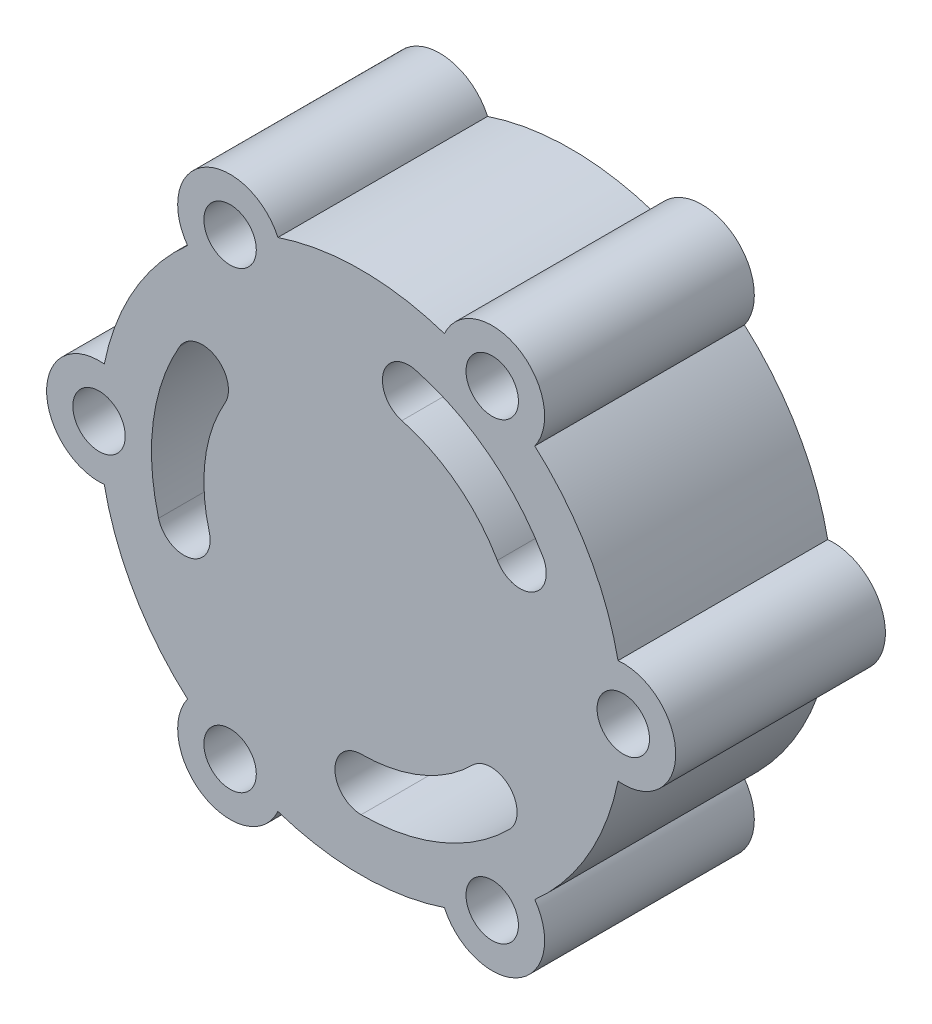
ISO-10303-21;
HEADER;
FILE_DESCRIPTION(('STEP AP214'),'2;1');
FILE_NAME('part.step','',(''),(''),'','','');
FILE_SCHEMA(('AUTOMOTIVE_DESIGN { 1 0 10303 214 1 1 1 1 }'));
ENDSEC;
DATA;
#1=APPLICATION_CONTEXT('core data for automotive mechanical design processes');
#2=APPLICATION_PROTOCOL_DEFINITION('international standard','automotive_design',2000,#1);
#3=PRODUCT_CONTEXT('',#1,'mechanical');
#4=PRODUCT('Part','Part','',(#3));
#5=PRODUCT_RELATED_PRODUCT_CATEGORY('part','',(#4));
#6=PRODUCT_DEFINITION_FORMATION('','',#4);
#7=PRODUCT_DEFINITION_CONTEXT('part definition',#1,'design');
#8=PRODUCT_DEFINITION('design','',#6,#7);
#9=PRODUCT_DEFINITION_SHAPE('','',#8);
#10=(LENGTH_UNIT() NAMED_UNIT(*) SI_UNIT(.MILLI.,.METRE.));
#11=(NAMED_UNIT(*) PLANE_ANGLE_UNIT() SI_UNIT($,.RADIAN.));
#12=(NAMED_UNIT(*) SI_UNIT($,.STERADIAN.) SOLID_ANGLE_UNIT());
#13=UNCERTAINTY_MEASURE_WITH_UNIT(LENGTH_MEASURE(1.E-05),#10,'distance_accuracy_value','');
#14=(GEOMETRIC_REPRESENTATION_CONTEXT(3) GLOBAL_UNCERTAINTY_ASSIGNED_CONTEXT((#13)) GLOBAL_UNIT_ASSIGNED_CONTEXT((#10,
#11,#12)) REPRESENTATION_CONTEXT('',''));
#15=CARTESIAN_POINT('',(0.,0.,0.));
#16=DIRECTION('',(0.,0.,1.));
#17=DIRECTION('',(1.,0.,0.));
#18=AXIS2_PLACEMENT_3D('',#15,#16,#17);
#19=CARTESIAN_POINT('',(57.5,91.650635094611,40.));
#20=DIRECTION('',(0.,0.,1.));
#21=DIRECTION('',(1.,0.,0.));
#22=AXIS2_PLACEMENT_3D('',#19,#20,#21);
#23=PLANE('',#22);
#24=CARTESIAN_POINT('',(45.,113.301270189222,40.));
#25=DIRECTION('',(0.,0.,1.));
#26=DIRECTION('',(1.,0.,0.));
#27=AXIS2_PLACEMENT_3D('',#24,#25,#26);
#28=CIRCLE('',#27,5.00000000000002);
#29=CARTESIAN_POINT('',(50.,113.301270189222,40.));
#30=VERTEX_POINT('',#29);
#31=EDGE_CURVE('E893',#30,#30,#28,.T.);
#32=ORIENTED_EDGE('',*,*,#31,.F.);
#33=EDGE_LOOP('',(#32));
#34=FACE_BOUND('',#33,.T.);
#35=CARTESIAN_POINT('',(45.,26.6987298107781,40.));
#36=DIRECTION('',(0.,0.,1.));
#37=DIRECTION('',(1.,0.,0.));
#38=AXIS2_PLACEMENT_3D('',#35,#36,#37);
#39=CIRCLE('',#38,5.);
#40=CARTESIAN_POINT('',(50.,26.6987298107781,40.));
#41=VERTEX_POINT('',#40);
#42=EDGE_CURVE('E909',#41,#41,#39,.T.);
#43=ORIENTED_EDGE('',*,*,#42,.F.);
#44=EDGE_LOOP('',(#43));
#45=FACE_BOUND('',#44,.T.);
#46=CARTESIAN_POINT('',(70.,70.,40.));
#47=DIRECTION('',(0.,0.,1.));
#48=DIRECTION('',(1.,0.,0.));
#49=AXIS2_PLACEMENT_3D('',#46,#47,#48);
#50=CIRCLE('',#49,39.9999999999999);
#51=CARTESIAN_POINT('',(35.3589838486223,89.9999999999996,40.));
#52=VERTEX_POINT('',#51);
#53=CARTESIAN_POINT('',(31.3629669484375,59.6472381958987,40.));
#54=VERTEX_POINT('',#53);
#55=EDGE_CURVE('E214',#52,#54,#50,.T.);
#56=ORIENTED_EDGE('',*,*,#55,.F.);
#57=CARTESIAN_POINT('',(39.6891108675447,87.4999999999995,40.));
#58=DIRECTION('',(0.,0.,1.));
#59=DIRECTION('',(1.,0.,0.));
#60=AXIS2_PLACEMENT_3D('',#57,#58,#59);
#61=CIRCLE('',#60,5.);
#62=CARTESIAN_POINT('',(44.0192378864666,84.9999999999996,40.));
#63=VERTEX_POINT('',#62);
#64=EDGE_CURVE('E205',#63,#52,#61,.T.);
#65=ORIENTED_EDGE('',*,*,#64,.F.);
#66=CARTESIAN_POINT('',(70.,70.,40.));
#67=DIRECTION('',(0.,0.,-1.));
#68=DIRECTION('',(1.,0.,0.));
#69=AXIS2_PLACEMENT_3D('',#66,#67,#68);
#70=CIRCLE('',#69,29.9999999999999);
#71=CARTESIAN_POINT('',(41.0222252113281,62.2354286469238,40.));
#72=VERTEX_POINT('',#71);
#73=EDGE_CURVE('E232',#72,#63,#70,.T.);
#74=ORIENTED_EDGE('',*,*,#73,.F.);
#75=CARTESIAN_POINT('',(36.1925960798825,60.9413334214112,40.));
#76=DIRECTION('',(0.,0.,1.));
#77=DIRECTION('',(1.,0.,0.));
#78=AXIS2_PLACEMENT_3D('',#75,#76,#77);
#79=CIRCLE('',#78,5.);
#80=EDGE_CURVE('E228',#54,#72,#79,.T.);
#81=ORIENTED_EDGE('',*,*,#80,.F.);
#82=EDGE_LOOP('',(#56,#65,#74,#81));
#83=FACE_BOUND('',#82,.T.);
#84=CARTESIAN_POINT('',(70.,70.,40.));
#85=DIRECTION('',(0.,0.,1.));
#86=DIRECTION('',(1.,0.,0.));
#87=AXIS2_PLACEMENT_3D('',#84,#85,#86);
#88=CIRCLE('',#87,40.0000000000006);
#89=CARTESIAN_POINT('',(70.0000000000005,29.9999999999994,40.));
#90=VERTEX_POINT('',#89);
#91=CARTESIAN_POINT('',(98.2842712474624,41.7157287525377,40.));
#92=VERTEX_POINT('',#91);
#93=EDGE_CURVE('E259',#90,#92,#88,.T.);
#94=ORIENTED_EDGE('',*,*,#93,.F.);
#95=CARTESIAN_POINT('',(70.0000000000006,34.9999999999995,40.));
#96=DIRECTION('',(0.,0.,1.));
#97=DIRECTION('',(1.,0.,0.));
#98=AXIS2_PLACEMENT_3D('',#95,#96,#97);
#99=CIRCLE('',#98,5.);
#100=CARTESIAN_POINT('',(70.0000000000006,39.9999999999994,40.));
#101=VERTEX_POINT('',#100);
#102=EDGE_CURVE('E256',#101,#90,#99,.T.);
#103=ORIENTED_EDGE('',*,*,#102,.F.);
#104=CARTESIAN_POINT('',(70.,70.,40.));
#105=DIRECTION('',(0.,0.,-1.));
#106=DIRECTION('',(1.,0.,0.));
#107=AXIS2_PLACEMENT_3D('',#104,#105,#106);
#108=CIRCLE('',#107,30.0000000000006);
#109=CARTESIAN_POINT('',(91.213203435597,48.7867965644032,40.));
#110=VERTEX_POINT('',#109);
#111=EDGE_CURVE('E267',#110,#101,#108,.T.);
#112=ORIENTED_EDGE('',*,*,#111,.F.);
#113=CARTESIAN_POINT('',(94.7487373415298,45.2512626584703,40.));
#114=DIRECTION('',(0.,0.,1.));
#115=DIRECTION('',(1.,0.,0.));
#116=AXIS2_PLACEMENT_3D('',#113,#114,#115);
#117=CIRCLE('',#116,5.);
#118=EDGE_CURVE('E263',#92,#110,#117,.T.);
#119=ORIENTED_EDGE('',*,*,#118,.F.);
#120=EDGE_LOOP('',(#94,#103,#112,#119));
#121=FACE_BOUND('',#120,.T.);
#122=CARTESIAN_POINT('',(120.,70.,40.));
#123=DIRECTION('',(0.,0.,1.));
#124=DIRECTION('',(1.,0.,0.));
#125=AXIS2_PLACEMENT_3D('',#122,#123,#124);
#126=CIRCLE('',#125,5.00000000000003);
#127=CARTESIAN_POINT('',(125.,70.,40.));
#128=VERTEX_POINT('',#127);
#129=EDGE_CURVE('E299',#128,#128,#126,.T.);
#130=ORIENTED_EDGE('',*,*,#129,.F.);
#131=EDGE_LOOP('',(#130));
#132=FACE_BOUND('',#131,.T.);
#133=CARTESIAN_POINT('',(70.,70.,40.));
#134=DIRECTION('',(0.,0.,1.));
#135=DIRECTION('',(1.,0.,0.));
#136=AXIS2_PLACEMENT_3D('',#133,#134,#135);
#137=CIRCLE('',#136,50.);
#138=CARTESIAN_POINT('',(85.8831560301929,117.410181970971,40.));
#139=VERTEX_POINT('',#138);
#140=CARTESIAN_POINT('',(54.116843969807,117.410181970971,40.));
#141=VERTEX_POINT('',#140);
#142=EDGE_CURVE('E350',#139,#141,#137,.T.);
#143=ORIENTED_EDGE('',*,*,#142,.T.);
#144=CARTESIAN_POINT('',(45.,113.301270189222,40.));
#145=DIRECTION('',(0.,0.,1.));
#146=DIRECTION('',(1.,0.,0.));
#147=AXIS2_PLACEMENT_3D('',#144,#145,#146);
#148=CIRCLE('',#147,9.99999999999996);
#149=CARTESIAN_POINT('',(36.883156030193,107.460307599904,40.));
#150=VERTEX_POINT('',#149);
#151=EDGE_CURVE('E354',#141,#150,#148,.T.);
#152=ORIENTED_EDGE('',*,*,#151,.T.);
#153=CARTESIAN_POINT('',(70.,70.,40.));
#154=DIRECTION('',(0.,0.,1.));
#155=DIRECTION('',(1.,0.,0.));
#156=AXIS2_PLACEMENT_3D('',#153,#154,#155);
#157=CIRCLE('',#156,50.);
#158=CARTESIAN_POINT('',(21.,79.9498743710662,40.));
#159=VERTEX_POINT('',#158);
#160=EDGE_CURVE('E358',#150,#159,#157,.T.);
#161=ORIENTED_EDGE('',*,*,#160,.T.);
#162=CARTESIAN_POINT('',(20.,70.,40.));
#163=DIRECTION('',(0.,0.,1.));
#164=DIRECTION('',(1.,0.,0.));
#165=AXIS2_PLACEMENT_3D('',#162,#163,#164);
#166=CIRCLE('',#165,10.);
#167=CARTESIAN_POINT('',(21.,60.0501256289338,40.));
#168=VERTEX_POINT('',#167);
#169=EDGE_CURVE('E361',#159,#168,#166,.T.);
#170=ORIENTED_EDGE('',*,*,#169,.T.);
#171=CARTESIAN_POINT('',(70.,70.,40.));
#172=DIRECTION('',(0.,0.,1.));
#173=DIRECTION('',(1.,0.,0.));
#174=AXIS2_PLACEMENT_3D('',#171,#172,#173);
#175=CIRCLE('',#174,50.);
#176=CARTESIAN_POINT('',(36.8831560301929,32.5396924000956,40.));
#177=VERTEX_POINT('',#176);
#178=EDGE_CURVE('E364',#168,#177,#175,.T.);
#179=ORIENTED_EDGE('',*,*,#178,.T.);
#180=CARTESIAN_POINT('',(45.,26.6987298107781,40.));
#181=DIRECTION('',(0.,0.,1.));
#182=DIRECTION('',(1.,0.,0.));
#183=AXIS2_PLACEMENT_3D('',#180,#181,#182);
#184=CIRCLE('',#183,10.);
#185=CARTESIAN_POINT('',(54.1168439698071,22.5898180290294,40.));
#186=VERTEX_POINT('',#185);
#187=EDGE_CURVE('E367',#177,#186,#184,.T.);
#188=ORIENTED_EDGE('',*,*,#187,.T.);
#189=CARTESIAN_POINT('',(70.,70.,40.));
#190=DIRECTION('',(0.,0.,1.));
#191=DIRECTION('',(1.,0.,0.));
#192=AXIS2_PLACEMENT_3D('',#189,#190,#191);
#193=CIRCLE('',#192,50.);
#194=CARTESIAN_POINT('',(85.883156030193,22.5898180290294,40.));
#195=VERTEX_POINT('',#194);
#196=EDGE_CURVE('E370',#186,#195,#193,.T.);
#197=ORIENTED_EDGE('',*,*,#196,.T.);
#198=CARTESIAN_POINT('',(95.,26.6987298107781,40.));
#199=DIRECTION('',(0.,0.,1.));
#200=DIRECTION('',(1.,0.,0.));
#201=AXIS2_PLACEMENT_3D('',#198,#199,#200);
#202=CIRCLE('',#201,9.99999999999996);
#203=CARTESIAN_POINT('',(103.116843969807,32.5396924000956,40.));
#204=VERTEX_POINT('',#203);
#205=EDGE_CURVE('E373',#195,#204,#202,.T.);
#206=ORIENTED_EDGE('',*,*,#205,.T.);
#207=CARTESIAN_POINT('',(70.,70.,40.));
#208=DIRECTION('',(0.,0.,1.));
#209=DIRECTION('',(1.,0.,0.));
#210=AXIS2_PLACEMENT_3D('',#207,#208,#209);
#211=CIRCLE('',#210,50.);
#212=CARTESIAN_POINT('',(119.,60.0501256289338,40.));
#213=VERTEX_POINT('',#212);
#214=EDGE_CURVE('E376',#204,#213,#211,.T.);
#215=ORIENTED_EDGE('',*,*,#214,.T.);
#216=CARTESIAN_POINT('',(120.,70.,40.));
#217=DIRECTION('',(0.,0.,1.));
#218=DIRECTION('',(1.,0.,0.));
#219=AXIS2_PLACEMENT_3D('',#216,#217,#218);
#220=CIRCLE('',#219,10.);
#221=CARTESIAN_POINT('',(119.,79.9498743710662,40.));
#222=VERTEX_POINT('',#221);
#223=EDGE_CURVE('E379',#213,#222,#220,.T.);
#224=ORIENTED_EDGE('',*,*,#223,.T.);
#225=CARTESIAN_POINT('',(70.,70.,40.));
#226=DIRECTION('',(0.,0.,1.));
#227=DIRECTION('',(1.,0.,0.));
#228=AXIS2_PLACEMENT_3D('',#225,#226,#227);
#229=CIRCLE('',#228,50.);
#230=CARTESIAN_POINT('',(103.116843969807,107.460307599904,40.));
#231=VERTEX_POINT('',#230);
#232=EDGE_CURVE('E382',#222,#231,#229,.T.);
#233=ORIENTED_EDGE('',*,*,#232,.T.);
#234=CARTESIAN_POINT('',(95.,113.301270189222,40.));
#235=DIRECTION('',(0.,0.,1.));
#236=DIRECTION('',(1.,0.,0.));
#237=AXIS2_PLACEMENT_3D('',#234,#235,#236);
#238=CIRCLE('',#237,10.);
#239=EDGE_CURVE('E385',#231,#139,#238,.T.);
#240=ORIENTED_EDGE('',*,*,#239,.T.);
#241=EDGE_LOOP('',(#143,#152,#161,#170,#179,#188,#197,#206,#215,#224,#233,#240));
#242=FACE_BOUND('',#241,.T.);
#243=CARTESIAN_POINT('',(70.,70.,40.));
#244=DIRECTION('',(0.,0.,1.));
#245=DIRECTION('',(1.,0.,0.));
#246=AXIS2_PLACEMENT_3D('',#243,#244,#245);
#247=CIRCLE('',#246,40.);
#248=CARTESIAN_POINT('',(104.641016151378,90.,40.));
#249=VERTEX_POINT('',#248);
#250=CARTESIAN_POINT('',(80.3527618041007,108.637033051563,40.));
#251=VERTEX_POINT('',#250);
#252=EDGE_CURVE('E310',#249,#251,#247,.T.);
#253=ORIENTED_EDGE('',*,*,#252,.F.);
#254=CARTESIAN_POINT('',(100.310889132455,87.5000000000001,40.));
#255=DIRECTION('',(0.,0.,1.));
#256=DIRECTION('',(1.,0.,0.));
#257=AXIS2_PLACEMENT_3D('',#254,#255,#256);
#258=CIRCLE('',#257,5.);
#259=CARTESIAN_POINT('',(95.9807621135331,85.,40.));
#260=VERTEX_POINT('',#259);
#261=EDGE_CURVE('E307',#260,#249,#258,.T.);
#262=ORIENTED_EDGE('',*,*,#261,.F.);
#263=CARTESIAN_POINT('',(70.,70.,40.));
#264=DIRECTION('',(0.,0.,-1.));
#265=DIRECTION('',(1.,0.,0.));
#266=AXIS2_PLACEMENT_3D('',#263,#264,#265);
#267=CIRCLE('',#266,30.);
#268=CARTESIAN_POINT('',(77.7645713530755,98.9777747886721,40.));
#269=VERTEX_POINT('',#268);
#270=EDGE_CURVE('E318',#269,#260,#267,.T.);
#271=ORIENTED_EDGE('',*,*,#270,.F.);
#272=CARTESIAN_POINT('',(79.0586665785881,103.807403920117,40.));
#273=DIRECTION('',(0.,0.,1.));
#274=DIRECTION('',(1.,0.,0.));
#275=AXIS2_PLACEMENT_3D('',#272,#273,#274);
#276=CIRCLE('',#275,5.);
#277=EDGE_CURVE('E314',#251,#269,#276,.T.);
#278=ORIENTED_EDGE('',*,*,#277,.F.);
#279=EDGE_LOOP('',(#253,#262,#271,#278));
#280=FACE_BOUND('',#279,.T.);
#281=CARTESIAN_POINT('',(95.,26.6987298107781,40.));
#282=DIRECTION('',(0.,0.,1.));
#283=DIRECTION('',(1.,0.,0.));
#284=AXIS2_PLACEMENT_3D('',#281,#282,#283);
#285=CIRCLE('',#284,5.);
#286=CARTESIAN_POINT('',(100.,26.6987298107781,40.));
#287=VERTEX_POINT('',#286);
#288=EDGE_CURVE('E240',#287,#287,#285,.T.);
#289=ORIENTED_EDGE('',*,*,#288,.F.);
#290=EDGE_LOOP('',(#289));
#291=FACE_BOUND('',#290,.T.);
#292=CARTESIAN_POINT('',(20.,70.,40.));
#293=DIRECTION('',(0.,0.,1.));
#294=DIRECTION('',(1.,0.,0.));
#295=AXIS2_PLACEMENT_3D('',#292,#293,#294);
#296=CIRCLE('',#295,5.00000000000001);
#297=CARTESIAN_POINT('',(25.,70.,40.));
#298=VERTEX_POINT('',#297);
#299=EDGE_CURVE('E901',#298,#298,#296,.T.);
#300=ORIENTED_EDGE('',*,*,#299,.F.);
#301=EDGE_LOOP('',(#300));
#302=FACE_BOUND('',#301,.T.);
#303=CARTESIAN_POINT('',(95.,113.301270189222,40.));
#304=DIRECTION('',(0.,0.,1.));
#305=DIRECTION('',(1.,0.,0.));
#306=AXIS2_PLACEMENT_3D('',#303,#304,#305);
#307=CIRCLE('',#306,5.00000000000001);
#308=CARTESIAN_POINT('',(100.,113.301270189222,40.));
#309=VERTEX_POINT('',#308);
#310=EDGE_CURVE('E882',#309,#309,#307,.T.);
#311=ORIENTED_EDGE('',*,*,#310,.F.);
#312=EDGE_LOOP('',(#311));
#313=FACE_BOUND('',#312,.T.);
#314=ADVANCED_FACE('F43',(#34,#45,#83,#121,#132,#242,#280,#291,#302,#313),#23,.T.);
#315=CARTESIAN_POINT('',(57.5,91.650635094611,0.));
#316=DIRECTION('',(0.,0.,1.));
#317=DIRECTION('',(1.,0.,0.));
#318=AXIS2_PLACEMENT_3D('',#315,#316,#317);
#319=PLANE('',#318);
#320=CARTESIAN_POINT('',(70.0000000000006,34.9999999999995,0.));
#321=DIRECTION('',(0.,0.,1.));
#322=DIRECTION('',(1.,0.,0.));
#323=AXIS2_PLACEMENT_3D('',#320,#321,#322);
#324=CIRCLE('',#323,5.);
#325=CARTESIAN_POINT('',(70.0000000000006,39.9999999999994,0.));
#326=VERTEX_POINT('',#325);
#327=CARTESIAN_POINT('',(70.0000000000005,29.9999999999994,0.));
#328=VERTEX_POINT('',#327);
#329=EDGE_CURVE('E223',#326,#328,#324,.T.);
#330=ORIENTED_EDGE('',*,*,#329,.T.);
#331=CARTESIAN_POINT('',(70.,70.,0.));
#332=DIRECTION('',(0.,0.,1.));
#333=DIRECTION('',(1.,0.,0.));
#334=AXIS2_PLACEMENT_3D('',#331,#332,#333);
#335=CIRCLE('',#334,40.0000000000006);
#336=CARTESIAN_POINT('',(98.2842712474624,41.7157287525377,0.));
#337=VERTEX_POINT('',#336);
#338=EDGE_CURVE('E274',#328,#337,#335,.T.);
#339=ORIENTED_EDGE('',*,*,#338,.T.);
#340=CARTESIAN_POINT('',(94.7487373415298,45.2512626584703,0.));
#341=DIRECTION('',(0.,0.,1.));
#342=DIRECTION('',(1.,0.,0.));
#343=AXIS2_PLACEMENT_3D('',#340,#341,#342);
#344=CIRCLE('',#343,5.);
#345=CARTESIAN_POINT('',(91.2132034355971,48.7867965644031,0.));
#346=VERTEX_POINT('',#345);
#347=EDGE_CURVE('E278',#337,#346,#344,.T.);
#348=ORIENTED_EDGE('',*,*,#347,.T.);
#349=CARTESIAN_POINT('',(70.,70.,0.));
#350=DIRECTION('',(0.,0.,-1.));
#351=DIRECTION('',(1.,0.,0.));
#352=AXIS2_PLACEMENT_3D('',#349,#350,#351);
#353=CIRCLE('',#352,30.0000000000006);
#354=EDGE_CURVE('E260',#346,#326,#353,.T.);
#355=ORIENTED_EDGE('',*,*,#354,.T.);
#356=EDGE_LOOP('',(#330,#339,#348,#355));
#357=FACE_BOUND('',#356,.T.);
#358=CARTESIAN_POINT('',(70.,70.,0.));
#359=DIRECTION('',(0.,0.,1.));
#360=DIRECTION('',(1.,0.,0.));
#361=AXIS2_PLACEMENT_3D('',#358,#359,#360);
#362=CIRCLE('',#361,50.);
#363=CARTESIAN_POINT('',(85.8831560301929,117.410181970971,0.));
#364=VERTEX_POINT('',#363);
#365=CARTESIAN_POINT('',(54.116843969807,117.410181970971,0.));
#366=VERTEX_POINT('',#365);
#367=EDGE_CURVE('E349',#364,#366,#362,.T.);
#368=ORIENTED_EDGE('',*,*,#367,.F.);
#369=CARTESIAN_POINT('',(95.,113.301270189222,0.));
#370=DIRECTION('',(0.,0.,1.));
#371=DIRECTION('',(1.,0.,0.));
#372=AXIS2_PLACEMENT_3D('',#369,#370,#371);
#373=CIRCLE('',#372,10.);
#374=CARTESIAN_POINT('',(103.116843969807,107.460307599904,0.));
#375=VERTEX_POINT('',#374);
#376=EDGE_CURVE('E355',#375,#364,#373,.T.);
#377=ORIENTED_EDGE('',*,*,#376,.F.);
#378=CARTESIAN_POINT('',(70.,70.,0.));
#379=DIRECTION('',(0.,0.,1.));
#380=DIRECTION('',(1.,0.,0.));
#381=AXIS2_PLACEMENT_3D('',#378,#379,#380);
#382=CIRCLE('',#381,50.);
#383=CARTESIAN_POINT('',(119.,79.9498743710662,0.));
#384=VERTEX_POINT('',#383);
#385=EDGE_CURVE('E419',#384,#375,#382,.T.);
#386=ORIENTED_EDGE('',*,*,#385,.F.);
#387=CARTESIAN_POINT('',(120.,70.,0.));
#388=DIRECTION('',(0.,0.,1.));
#389=DIRECTION('',(1.,0.,0.));
#390=AXIS2_PLACEMENT_3D('',#387,#388,#389);
#391=CIRCLE('',#390,10.);
#392=CARTESIAN_POINT('',(119.,60.0501256289338,0.));
#393=VERTEX_POINT('',#392);
#394=EDGE_CURVE('E416',#393,#384,#391,.T.);
#395=ORIENTED_EDGE('',*,*,#394,.F.);
#396=CARTESIAN_POINT('',(70.,70.,0.));
#397=DIRECTION('',(0.,0.,1.));
#398=DIRECTION('',(1.,0.,0.));
#399=AXIS2_PLACEMENT_3D('',#396,#397,#398);
#400=CIRCLE('',#399,50.);
#401=CARTESIAN_POINT('',(103.116843969807,32.5396924000956,0.));
#402=VERTEX_POINT('',#401);
#403=EDGE_CURVE('E413',#402,#393,#400,.T.);
#404=ORIENTED_EDGE('',*,*,#403,.F.);
#405=CARTESIAN_POINT('',(95.,26.6987298107781,0.));
#406=DIRECTION('',(0.,0.,1.));
#407=DIRECTION('',(1.,0.,0.));
#408=AXIS2_PLACEMENT_3D('',#405,#406,#407);
#409=CIRCLE('',#408,9.99999999999996);
#410=CARTESIAN_POINT('',(85.883156030193,22.5898180290294,0.));
#411=VERTEX_POINT('',#410);
#412=EDGE_CURVE('E410',#411,#402,#409,.T.);
#413=ORIENTED_EDGE('',*,*,#412,.F.);
#414=CARTESIAN_POINT('',(70.,70.,0.));
#415=DIRECTION('',(0.,0.,1.));
#416=DIRECTION('',(1.,0.,0.));
#417=AXIS2_PLACEMENT_3D('',#414,#415,#416);
#418=CIRCLE('',#417,50.);
#419=CARTESIAN_POINT('',(54.1168439698071,22.5898180290294,0.));
#420=VERTEX_POINT('',#419);
#421=EDGE_CURVE('E407',#420,#411,#418,.T.);
#422=ORIENTED_EDGE('',*,*,#421,.F.);
#423=CARTESIAN_POINT('',(45.,26.6987298107781,0.));
#424=DIRECTION('',(0.,0.,1.));
#425=DIRECTION('',(1.,0.,0.));
#426=AXIS2_PLACEMENT_3D('',#423,#424,#425);
#427=CIRCLE('',#426,10.);
#428=CARTESIAN_POINT('',(36.8831560301929,32.5396924000956,0.));
#429=VERTEX_POINT('',#428);
#430=EDGE_CURVE('E404',#429,#420,#427,.T.);
#431=ORIENTED_EDGE('',*,*,#430,.F.);
#432=CARTESIAN_POINT('',(70.,70.,0.));
#433=DIRECTION('',(0.,0.,1.));
#434=DIRECTION('',(1.,0.,0.));
#435=AXIS2_PLACEMENT_3D('',#432,#433,#434);
#436=CIRCLE('',#435,50.);
#437=CARTESIAN_POINT('',(21.,60.0501256289338,0.));
#438=VERTEX_POINT('',#437);
#439=EDGE_CURVE('E401',#438,#429,#436,.T.);
#440=ORIENTED_EDGE('',*,*,#439,.F.);
#441=CARTESIAN_POINT('',(20.,70.,0.));
#442=DIRECTION('',(0.,0.,1.));
#443=DIRECTION('',(1.,0.,0.));
#444=AXIS2_PLACEMENT_3D('',#441,#442,#443);
#445=CIRCLE('',#444,10.);
#446=CARTESIAN_POINT('',(21.,79.9498743710662,0.));
#447=VERTEX_POINT('',#446);
#448=EDGE_CURVE('E398',#447,#438,#445,.T.);
#449=ORIENTED_EDGE('',*,*,#448,.F.);
#450=CARTESIAN_POINT('',(70.,70.,0.));
#451=DIRECTION('',(0.,0.,1.));
#452=DIRECTION('',(1.,0.,0.));
#453=AXIS2_PLACEMENT_3D('',#450,#451,#452);
#454=CIRCLE('',#453,50.);
#455=CARTESIAN_POINT('',(36.883156030193,107.460307599904,0.));
#456=VERTEX_POINT('',#455);
#457=EDGE_CURVE('E395',#456,#447,#454,.T.);
#458=ORIENTED_EDGE('',*,*,#457,.F.);
#459=CARTESIAN_POINT('',(45.,113.301270189222,0.));
#460=DIRECTION('',(0.,0.,1.));
#461=DIRECTION('',(1.,0.,0.));
#462=AXIS2_PLACEMENT_3D('',#459,#460,#461);
#463=CIRCLE('',#462,9.99999999999996);
#464=EDGE_CURVE('E392',#366,#456,#463,.T.);
#465=ORIENTED_EDGE('',*,*,#464,.F.);
#466=EDGE_LOOP('',(#368,#377,#386,#395,#404,#413,#422,#431,#440,#449,#458,#465));
#467=FACE_BOUND('',#466,.T.);
#468=CARTESIAN_POINT('',(100.310889132455,87.5000000000001,0.));
#469=DIRECTION('',(0.,0.,1.));
#470=DIRECTION('',(1.,0.,0.));
#471=AXIS2_PLACEMENT_3D('',#468,#469,#470);
#472=CIRCLE('',#471,5.);
#473=CARTESIAN_POINT('',(95.9807621135331,85.,0.));
#474=VERTEX_POINT('',#473);
#475=CARTESIAN_POINT('',(104.641016151378,90.,0.));
#476=VERTEX_POINT('',#475);
#477=EDGE_CURVE('E303',#474,#476,#472,.T.);
#478=ORIENTED_EDGE('',*,*,#477,.T.);
#479=CARTESIAN_POINT('',(70.,70.,0.));
#480=DIRECTION('',(0.,0.,1.));
#481=DIRECTION('',(1.,0.,0.));
#482=AXIS2_PLACEMENT_3D('',#479,#480,#481);
#483=CIRCLE('',#482,40.);
#484=CARTESIAN_POINT('',(80.3527618041007,108.637033051563,0.));
#485=VERTEX_POINT('',#484);
#486=EDGE_CURVE('E325',#476,#485,#483,.T.);
#487=ORIENTED_EDGE('',*,*,#486,.T.);
#488=CARTESIAN_POINT('',(79.0586665785881,103.807403920117,0.));
#489=DIRECTION('',(0.,0.,1.));
#490=DIRECTION('',(1.,0.,0.));
#491=AXIS2_PLACEMENT_3D('',#488,#489,#490);
#492=CIRCLE('',#491,5.);
#493=CARTESIAN_POINT('',(77.7645713530755,98.9777747886721,0.));
#494=VERTEX_POINT('',#493);
#495=EDGE_CURVE('E329',#485,#494,#492,.T.);
#496=ORIENTED_EDGE('',*,*,#495,.T.);
#497=CARTESIAN_POINT('',(70.,70.,0.));
#498=DIRECTION('',(0.,0.,-1.));
#499=DIRECTION('',(1.,0.,0.));
#500=AXIS2_PLACEMENT_3D('',#497,#498,#499);
#501=CIRCLE('',#500,30.);
#502=EDGE_CURVE('E311',#494,#474,#501,.T.);
#503=ORIENTED_EDGE('',*,*,#502,.T.);
#504=EDGE_LOOP('',(#478,#487,#496,#503));
#505=FACE_BOUND('',#504,.T.);
#506=CARTESIAN_POINT('',(120.,70.,0.));
#507=DIRECTION('',(0.,0.,1.));
#508=DIRECTION('',(1.,0.,0.));
#509=AXIS2_PLACEMENT_3D('',#506,#507,#508);
#510=CIRCLE('',#509,5.00000000000003);
#511=CARTESIAN_POINT('',(125.,70.,0.));
#512=VERTEX_POINT('',#511);
#513=EDGE_CURVE('E298',#512,#512,#510,.T.);
#514=ORIENTED_EDGE('',*,*,#513,.T.);
#515=EDGE_LOOP('',(#514));
#516=FACE_BOUND('',#515,.T.);
#517=CARTESIAN_POINT('',(39.6891108675447,87.4999999999995,0.));
#518=DIRECTION('',(0.,0.,1.));
#519=DIRECTION('',(1.,0.,0.));
#520=AXIS2_PLACEMENT_3D('',#517,#518,#519);
#521=CIRCLE('',#520,5.);
#522=CARTESIAN_POINT('',(44.0192378864667,84.9999999999996,0.));
#523=VERTEX_POINT('',#522);
#524=CARTESIAN_POINT('',(35.3589838486223,89.9999999999996,0.));
#525=VERTEX_POINT('',#524);
#526=EDGE_CURVE('E67',#523,#525,#521,.T.);
#527=ORIENTED_EDGE('',*,*,#526,.T.);
#528=CARTESIAN_POINT('',(70.,70.,0.));
#529=DIRECTION('',(0.,0.,1.));
#530=DIRECTION('',(1.,0.,0.));
#531=AXIS2_PLACEMENT_3D('',#528,#529,#530);
#532=CIRCLE('',#531,39.9999999999999);
#533=CARTESIAN_POINT('',(31.3629669484375,59.6472381958987,0.));
#534=VERTEX_POINT('',#533);
#535=EDGE_CURVE('E221',#525,#534,#532,.T.);
#536=ORIENTED_EDGE('',*,*,#535,.T.);
#537=CARTESIAN_POINT('',(36.1925960798825,60.9413334214112,0.));
#538=DIRECTION('',(0.,0.,1.));
#539=DIRECTION('',(1.,0.,0.));
#540=AXIS2_PLACEMENT_3D('',#537,#538,#539);
#541=CIRCLE('',#540,5.);
#542=CARTESIAN_POINT('',(41.0222252113278,62.2354286469237,0.));
#543=VERTEX_POINT('',#542);
#544=EDGE_CURVE('E243',#534,#543,#541,.T.);
#545=ORIENTED_EDGE('',*,*,#544,.T.);
#546=CARTESIAN_POINT('',(70.,70.,0.));
#547=DIRECTION('',(0.,0.,-1.));
#548=DIRECTION('',(1.,0.,0.));
#549=AXIS2_PLACEMENT_3D('',#546,#547,#548);
#550=CIRCLE('',#549,29.9999999999999);
#551=EDGE_CURVE('E215',#543,#523,#550,.T.);
#552=ORIENTED_EDGE('',*,*,#551,.T.);
#553=EDGE_LOOP('',(#527,#536,#545,#552));
#554=FACE_BOUND('',#553,.T.);
#555=CARTESIAN_POINT('',(95.,26.6987298107781,0.));
#556=DIRECTION('',(0.,0.,1.));
#557=DIRECTION('',(1.,0.,0.));
#558=AXIS2_PLACEMENT_3D('',#555,#556,#557);
#559=CIRCLE('',#558,5.);
#560=CARTESIAN_POINT('',(100.,26.6987298107781,0.));
#561=VERTEX_POINT('',#560);
#562=EDGE_CURVE('E913',#561,#561,#559,.T.);
#563=ORIENTED_EDGE('',*,*,#562,.T.);
#564=EDGE_LOOP('',(#563));
#565=FACE_BOUND('',#564,.T.);
#566=CARTESIAN_POINT('',(45.,26.6987298107781,0.));
#567=DIRECTION('',(0.,0.,1.));
#568=DIRECTION('',(1.,0.,0.));
#569=AXIS2_PLACEMENT_3D('',#566,#567,#568);
#570=CIRCLE('',#569,5.);
#571=CARTESIAN_POINT('',(50.,26.6987298107781,0.));
#572=VERTEX_POINT('',#571);
#573=EDGE_CURVE('E905',#572,#572,#570,.T.);
#574=ORIENTED_EDGE('',*,*,#573,.T.);
#575=EDGE_LOOP('',(#574));
#576=FACE_BOUND('',#575,.T.);
#577=CARTESIAN_POINT('',(20.,70.,0.));
#578=DIRECTION('',(0.,0.,1.));
#579=DIRECTION('',(1.,0.,0.));
#580=AXIS2_PLACEMENT_3D('',#577,#578,#579);
#581=CIRCLE('',#580,5.00000000000001);
#582=CARTESIAN_POINT('',(25.,70.,0.));
#583=VERTEX_POINT('',#582);
#584=EDGE_CURVE('E897',#583,#583,#581,.T.);
#585=ORIENTED_EDGE('',*,*,#584,.T.);
#586=EDGE_LOOP('',(#585));
#587=FACE_BOUND('',#586,.T.);
#588=CARTESIAN_POINT('',(45.,113.301270189222,0.));
#589=DIRECTION('',(0.,0.,1.));
#590=DIRECTION('',(1.,0.,0.));
#591=AXIS2_PLACEMENT_3D('',#588,#589,#590);
#592=CIRCLE('',#591,5.00000000000002);
#593=CARTESIAN_POINT('',(50.,113.301270189222,0.));
#594=VERTEX_POINT('',#593);
#595=EDGE_CURVE('E890',#594,#594,#592,.T.);
#596=ORIENTED_EDGE('',*,*,#595,.T.);
#597=EDGE_LOOP('',(#596));
#598=FACE_BOUND('',#597,.T.);
#599=CARTESIAN_POINT('',(95.,113.301270189222,0.));
#600=DIRECTION('',(0.,0.,1.));
#601=DIRECTION('',(1.,0.,0.));
#602=AXIS2_PLACEMENT_3D('',#599,#600,#601);
#603=CIRCLE('',#602,5.00000000000001);
#604=CARTESIAN_POINT('',(100.,113.301270189222,0.));
#605=VERTEX_POINT('',#604);
#606=EDGE_CURVE('E885',#605,#605,#603,.T.);
#607=ORIENTED_EDGE('',*,*,#606,.T.);
#608=EDGE_LOOP('',(#607));
#609=FACE_BOUND('',#608,.T.);
#610=ADVANCED_FACE('F474',(#357,#467,#505,#516,#554,#565,#576,#587,#598,#609),#319,.F.);
#611=CARTESIAN_POINT('',(70.,70.,40.));
#612=DIRECTION('',(0.,0.,-1.));
#613=DIRECTION('',(-1.,0.,0.));
#614=AXIS2_PLACEMENT_3D('',#611,#612,#613);
#615=CYLINDRICAL_SURFACE('',#614,50.);
#616=ORIENTED_EDGE('',*,*,#367,.T.);
#617=DIRECTION('',(0.,0.,-1.));
#618=VECTOR('',#617,1.);
#619=CARTESIAN_POINT('',(54.116843969807,117.410181970971,40.));
#620=LINE('',#619,#618);
#621=EDGE_CURVE('E11',#141,#366,#620,.T.);
#622=ORIENTED_EDGE('',*,*,#621,.F.);
#623=ORIENTED_EDGE('',*,*,#142,.F.);
#624=DIRECTION('',(0.,0.,-1.));
#625=VECTOR('',#624,1.);
#626=CARTESIAN_POINT('',(85.8831560301929,117.410181970971,40.));
#627=LINE('',#626,#625);
#628=EDGE_CURVE('E388',#139,#364,#627,.T.);
#629=ORIENTED_EDGE('',*,*,#628,.T.);
#630=EDGE_LOOP('',(#616,#622,#623,#629));
#631=FACE_BOUND('',#630,.T.);
#632=ADVANCED_FACE('F45',(#631),#615,.T.);
#633=CARTESIAN_POINT('',(45.,113.301270189222,40.));
#634=DIRECTION('',(0.,0.,-1.));
#635=DIRECTION('',(-1.,0.,0.));
#636=AXIS2_PLACEMENT_3D('',#633,#634,#635);
#637=CYLINDRICAL_SURFACE('',#636,9.99999999999996);
#638=ORIENTED_EDGE('',*,*,#464,.T.);
#639=DIRECTION('',(0.,0.,-1.));
#640=VECTOR('',#639,1.);
#641=CARTESIAN_POINT('',(36.883156030193,107.460307599904,40.));
#642=LINE('',#641,#640);
#643=EDGE_CURVE('E52',#150,#456,#642,.T.);
#644=ORIENTED_EDGE('',*,*,#643,.F.);
#645=ORIENTED_EDGE('',*,*,#151,.F.);
#646=ORIENTED_EDGE('',*,*,#621,.T.);
#647=EDGE_LOOP('',(#638,#644,#645,#646));
#648=FACE_BOUND('',#647,.T.);
#649=ADVANCED_FACE('F492',(#648),#637,.T.);
#650=CARTESIAN_POINT('',(70.,70.,40.));
#651=DIRECTION('',(0.,0.,-1.));
#652=DIRECTION('',(-1.,0.,0.));
#653=AXIS2_PLACEMENT_3D('',#650,#651,#652);
#654=CYLINDRICAL_SURFACE('',#653,50.);
#655=ORIENTED_EDGE('',*,*,#457,.T.);
#656=DIRECTION('',(0.,0.,-1.));
#657=VECTOR('',#656,1.);
#658=CARTESIAN_POINT('',(21.,79.9498743710662,40.));
#659=LINE('',#658,#657);
#660=EDGE_CURVE('E459',#159,#447,#659,.T.);
#661=ORIENTED_EDGE('',*,*,#660,.F.);
#662=ORIENTED_EDGE('',*,*,#160,.F.);
#663=ORIENTED_EDGE('',*,*,#643,.T.);
#664=EDGE_LOOP('',(#655,#661,#662,#663));
#665=FACE_BOUND('',#664,.T.);
#666=ADVANCED_FACE('F468',(#665),#654,.T.);
#667=CARTESIAN_POINT('',(20.,70.,40.));
#668=DIRECTION('',(0.,0.,-1.));
#669=DIRECTION('',(-1.,0.,0.));
#670=AXIS2_PLACEMENT_3D('',#667,#668,#669);
#671=CYLINDRICAL_SURFACE('',#670,10.);
#672=ORIENTED_EDGE('',*,*,#448,.T.);
#673=DIRECTION('',(0.,0.,-1.));
#674=VECTOR('',#673,1.);
#675=CARTESIAN_POINT('',(21.,60.0501256289338,40.));
#676=LINE('',#675,#674);
#677=EDGE_CURVE('E455',#168,#438,#676,.T.);
#678=ORIENTED_EDGE('',*,*,#677,.F.);
#679=ORIENTED_EDGE('',*,*,#169,.F.);
#680=ORIENTED_EDGE('',*,*,#660,.T.);
#681=EDGE_LOOP('',(#672,#678,#679,#680));
#682=FACE_BOUND('',#681,.T.);
#683=ADVANCED_FACE('F480',(#682),#671,.T.);
#684=CARTESIAN_POINT('',(70.,70.,40.));
#685=DIRECTION('',(0.,0.,-1.));
#686=DIRECTION('',(-1.,0.,0.));
#687=AXIS2_PLACEMENT_3D('',#684,#685,#686);
#688=CYLINDRICAL_SURFACE('',#687,50.);
#689=ORIENTED_EDGE('',*,*,#439,.T.);
#690=DIRECTION('',(0.,0.,-1.));
#691=VECTOR('',#690,1.);
#692=CARTESIAN_POINT('',(36.8831560301929,32.5396924000956,40.));
#693=LINE('',#692,#691);
#694=EDGE_CURVE('E451',#177,#429,#693,.T.);
#695=ORIENTED_EDGE('',*,*,#694,.F.);
#696=ORIENTED_EDGE('',*,*,#178,.F.);
#697=ORIENTED_EDGE('',*,*,#677,.T.);
#698=EDGE_LOOP('',(#689,#695,#696,#697));
#699=FACE_BOUND('',#698,.T.);
#700=ADVANCED_FACE('F484',(#699),#688,.T.);
#701=CARTESIAN_POINT('',(45.,26.6987298107781,40.));
#702=DIRECTION('',(0.,0.,-1.));
#703=DIRECTION('',(-1.,0.,0.));
#704=AXIS2_PLACEMENT_3D('',#701,#702,#703);
#705=CYLINDRICAL_SURFACE('',#704,10.);
#706=ORIENTED_EDGE('',*,*,#430,.T.);
#707=DIRECTION('',(0.,0.,-1.));
#708=VECTOR('',#707,1.);
#709=CARTESIAN_POINT('',(54.1168439698071,22.5898180290294,40.));
#710=LINE('',#709,#708);
#711=EDGE_CURVE('E447',#186,#420,#710,.T.);
#712=ORIENTED_EDGE('',*,*,#711,.F.);
#713=ORIENTED_EDGE('',*,*,#187,.F.);
#714=ORIENTED_EDGE('',*,*,#694,.T.);
#715=EDGE_LOOP('',(#706,#712,#713,#714));
#716=FACE_BOUND('',#715,.T.);
#717=ADVANCED_FACE('F525',(#716),#705,.T.);
#718=CARTESIAN_POINT('',(70.,70.,40.));
#719=DIRECTION('',(0.,0.,-1.));
#720=DIRECTION('',(-1.,0.,0.));
#721=AXIS2_PLACEMENT_3D('',#718,#719,#720);
#722=CYLINDRICAL_SURFACE('',#721,50.);
#723=ORIENTED_EDGE('',*,*,#421,.T.);
#724=DIRECTION('',(0.,0.,-1.));
#725=VECTOR('',#724,1.);
#726=CARTESIAN_POINT('',(85.883156030193,22.5898180290294,40.));
#727=LINE('',#726,#725);
#728=EDGE_CURVE('E443',#195,#411,#727,.T.);
#729=ORIENTED_EDGE('',*,*,#728,.F.);
#730=ORIENTED_EDGE('',*,*,#196,.F.);
#731=ORIENTED_EDGE('',*,*,#711,.T.);
#732=EDGE_LOOP('',(#723,#729,#730,#731));
#733=FACE_BOUND('',#732,.T.);
#734=ADVANCED_FACE('F523',(#733),#722,.T.);
#735=CARTESIAN_POINT('',(95.,26.6987298107781,40.));
#736=DIRECTION('',(0.,0.,-1.));
#737=DIRECTION('',(-1.,0.,0.));
#738=AXIS2_PLACEMENT_3D('',#735,#736,#737);
#739=CYLINDRICAL_SURFACE('',#738,9.99999999999996);
#740=ORIENTED_EDGE('',*,*,#412,.T.);
#741=DIRECTION('',(0.,0.,-1.));
#742=VECTOR('',#741,1.);
#743=CARTESIAN_POINT('',(103.116843969807,32.5396924000956,40.));
#744=LINE('',#743,#742);
#745=EDGE_CURVE('E439',#204,#402,#744,.T.);
#746=ORIENTED_EDGE('',*,*,#745,.F.);
#747=ORIENTED_EDGE('',*,*,#205,.F.);
#748=ORIENTED_EDGE('',*,*,#728,.T.);
#749=EDGE_LOOP('',(#740,#746,#747,#748));
#750=FACE_BOUND('',#749,.T.);
#751=ADVANCED_FACE('F519',(#750),#739,.T.);
#752=CARTESIAN_POINT('',(70.,70.,40.));
#753=DIRECTION('',(0.,0.,-1.));
#754=DIRECTION('',(-1.,0.,0.));
#755=AXIS2_PLACEMENT_3D('',#752,#753,#754);
#756=CYLINDRICAL_SURFACE('',#755,50.);
#757=ORIENTED_EDGE('',*,*,#403,.T.);
#758=DIRECTION('',(0.,0.,-1.));
#759=VECTOR('',#758,1.);
#760=CARTESIAN_POINT('',(119.,60.0501256289338,40.));
#761=LINE('',#760,#759);
#762=EDGE_CURVE('E435',#213,#393,#761,.T.);
#763=ORIENTED_EDGE('',*,*,#762,.F.);
#764=ORIENTED_EDGE('',*,*,#214,.F.);
#765=ORIENTED_EDGE('',*,*,#745,.T.);
#766=EDGE_LOOP('',(#757,#763,#764,#765));
#767=FACE_BOUND('',#766,.T.);
#768=ADVANCED_FACE('F514',(#767),#756,.T.);
#769=CARTESIAN_POINT('',(120.,70.,40.));
#770=DIRECTION('',(0.,0.,-1.));
#771=DIRECTION('',(-1.,0.,0.));
#772=AXIS2_PLACEMENT_3D('',#769,#770,#771);
#773=CYLINDRICAL_SURFACE('',#772,10.);
#774=ORIENTED_EDGE('',*,*,#394,.T.);
#775=DIRECTION('',(0.,0.,-1.));
#776=VECTOR('',#775,1.);
#777=CARTESIAN_POINT('',(119.,79.9498743710662,40.));
#778=LINE('',#777,#776);
#779=EDGE_CURVE('E431',#222,#384,#778,.T.);
#780=ORIENTED_EDGE('',*,*,#779,.F.);
#781=ORIENTED_EDGE('',*,*,#223,.F.);
#782=ORIENTED_EDGE('',*,*,#762,.T.);
#783=EDGE_LOOP('',(#774,#780,#781,#782));
#784=FACE_BOUND('',#783,.T.);
#785=ADVANCED_FACE('F508',(#784),#773,.T.);
#786=CARTESIAN_POINT('',(70.,70.,40.));
#787=DIRECTION('',(0.,0.,-1.));
#788=DIRECTION('',(-1.,0.,0.));
#789=AXIS2_PLACEMENT_3D('',#786,#787,#788);
#790=CYLINDRICAL_SURFACE('',#789,50.);
#791=ORIENTED_EDGE('',*,*,#385,.T.);
#792=DIRECTION('',(0.,0.,-1.));
#793=VECTOR('',#792,1.);
#794=CARTESIAN_POINT('',(103.116843969807,107.460307599904,40.));
#795=LINE('',#794,#793);
#796=EDGE_CURVE('E427',#231,#375,#795,.T.);
#797=ORIENTED_EDGE('',*,*,#796,.F.);
#798=ORIENTED_EDGE('',*,*,#232,.F.);
#799=ORIENTED_EDGE('',*,*,#779,.T.);
#800=EDGE_LOOP('',(#791,#797,#798,#799));
#801=FACE_BOUND('',#800,.T.);
#802=ADVANCED_FACE('F504',(#801),#790,.T.);
#803=CARTESIAN_POINT('',(95.,113.301270189222,40.));
#804=DIRECTION('',(0.,0.,-1.));
#805=DIRECTION('',(-1.,0.,0.));
#806=AXIS2_PLACEMENT_3D('',#803,#804,#805);
#807=CYLINDRICAL_SURFACE('',#806,10.);
#808=ORIENTED_EDGE('',*,*,#376,.T.);
#809=ORIENTED_EDGE('',*,*,#628,.F.);
#810=ORIENTED_EDGE('',*,*,#239,.F.);
#811=ORIENTED_EDGE('',*,*,#796,.T.);
#812=EDGE_LOOP('',(#808,#809,#810,#811));
#813=FACE_BOUND('',#812,.T.);
#814=ADVANCED_FACE('F499',(#813),#807,.T.);
#815=CARTESIAN_POINT('',(100.310889132455,87.5000000000001,40.));
#816=DIRECTION('',(0.,0.,-1.));
#817=DIRECTION('',(-1.,0.,0.));
#818=AXIS2_PLACEMENT_3D('',#815,#816,#817);
#819=CYLINDRICAL_SURFACE('',#818,5.);
#820=ORIENTED_EDGE('',*,*,#477,.F.);
#821=DIRECTION('',(0.,0.,-1.));
#822=VECTOR('',#821,1.);
#823=CARTESIAN_POINT('',(95.9807621135331,85.,40.));
#824=LINE('',#823,#822);
#825=EDGE_CURVE('E321',#260,#474,#824,.T.);
#826=ORIENTED_EDGE('',*,*,#825,.F.);
#827=ORIENTED_EDGE('',*,*,#261,.T.);
#828=DIRECTION('',(0.,0.,-1.));
#829=VECTOR('',#828,1.);
#830=CARTESIAN_POINT('',(104.641016151378,90.,40.));
#831=LINE('',#830,#829);
#832=EDGE_CURVE('E345',#249,#476,#831,.T.);
#833=ORIENTED_EDGE('',*,*,#832,.T.);
#834=EDGE_LOOP('',(#820,#826,#827,#833));
#835=FACE_BOUND('',#834,.T.);
#836=ADVANCED_FACE('F545',(#835),#819,.F.);
#837=CARTESIAN_POINT('',(70.,70.,40.));
#838=DIRECTION('',(0.,0.,-1.));
#839=DIRECTION('',(-1.,0.,0.));
#840=AXIS2_PLACEMENT_3D('',#837,#838,#839);
#841=CYLINDRICAL_SURFACE('',#840,40.);
#842=ORIENTED_EDGE('',*,*,#486,.F.);
#843=ORIENTED_EDGE('',*,*,#832,.F.);
#844=ORIENTED_EDGE('',*,*,#252,.T.);
#845=DIRECTION('',(0.,0.,-1.));
#846=VECTOR('',#845,1.);
#847=CARTESIAN_POINT('',(80.3527618041007,108.637033051563,40.));
#848=LINE('',#847,#846);
#849=EDGE_CURVE('E342',#251,#485,#848,.T.);
#850=ORIENTED_EDGE('',*,*,#849,.T.);
#851=EDGE_LOOP('',(#842,#843,#844,#850));
#852=FACE_BOUND('',#851,.T.);
#853=ADVANCED_FACE('F583',(#852),#841,.F.);
#854=CARTESIAN_POINT('',(79.0586665785881,103.807403920117,40.));
#855=DIRECTION('',(0.,0.,-1.));
#856=DIRECTION('',(-1.,0.,0.));
#857=AXIS2_PLACEMENT_3D('',#854,#855,#856);
#858=CYLINDRICAL_SURFACE('',#857,5.);
#859=ORIENTED_EDGE('',*,*,#495,.F.);
#860=ORIENTED_EDGE('',*,*,#849,.F.);
#861=ORIENTED_EDGE('',*,*,#277,.T.);
#862=DIRECTION('',(0.,0.,-1.));
#863=VECTOR('',#862,1.);
#864=CARTESIAN_POINT('',(77.7645713530755,98.9777747886721,40.));
#865=LINE('',#864,#863);
#866=EDGE_CURVE('E339',#269,#494,#865,.T.);
#867=ORIENTED_EDGE('',*,*,#866,.T.);
#868=EDGE_LOOP('',(#859,#860,#861,#867));
#869=FACE_BOUND('',#868,.T.);
#870=ADVANCED_FACE('F590',(#869),#858,.F.);
#871=CARTESIAN_POINT('',(70.,70.,40.));
#872=DIRECTION('',(0.,0.,-1.));
#873=DIRECTION('',(-1.,0.,0.));
#874=AXIS2_PLACEMENT_3D('',#871,#872,#873);
#875=CYLINDRICAL_SURFACE('',#874,30.);
#876=ORIENTED_EDGE('',*,*,#502,.F.);
#877=ORIENTED_EDGE('',*,*,#866,.F.);
#878=ORIENTED_EDGE('',*,*,#270,.T.);
#879=ORIENTED_EDGE('',*,*,#825,.T.);
#880=EDGE_LOOP('',(#876,#877,#878,#879));
#881=FACE_BOUND('',#880,.T.);
#882=ADVANCED_FACE('F597',(#881),#875,.T.);
#883=CARTESIAN_POINT('',(120.,70.,40.));
#884=DIRECTION('',(0.,0.,-1.));
#885=DIRECTION('',(-1.,0.,0.));
#886=AXIS2_PLACEMENT_3D('',#883,#884,#885);
#887=CYLINDRICAL_SURFACE('',#886,5.00000000000003);
#888=ORIENTED_EDGE('',*,*,#129,.T.);
#889=EDGE_LOOP('',(#888));
#890=FACE_BOUND('',#889,.T.);
#891=ORIENTED_EDGE('',*,*,#513,.F.);
#892=EDGE_LOOP('',(#891));
#893=FACE_BOUND('',#892,.T.);
#894=ADVANCED_FACE('F605',(#890,#893),#887,.F.);
#895=CARTESIAN_POINT('',(70.0000000000006,34.9999999999995,40.));
#896=DIRECTION('',(0.,0.,-1.));
#897=DIRECTION('',(-1.,0.,0.));
#898=AXIS2_PLACEMENT_3D('',#895,#896,#897);
#899=CYLINDRICAL_SURFACE('',#898,5.);
#900=ORIENTED_EDGE('',*,*,#329,.F.);
#901=DIRECTION('',(0.,0.,-1.));
#902=VECTOR('',#901,1.);
#903=CARTESIAN_POINT('',(70.0000000000006,39.9999999999994,40.));
#904=LINE('',#903,#902);
#905=EDGE_CURVE('E270',#101,#326,#904,.T.);
#906=ORIENTED_EDGE('',*,*,#905,.F.);
#907=ORIENTED_EDGE('',*,*,#102,.T.);
#908=DIRECTION('',(0.,0.,-1.));
#909=VECTOR('',#908,1.);
#910=CARTESIAN_POINT('',(70.0000000000005,29.9999999999994,40.));
#911=LINE('',#910,#909);
#912=EDGE_CURVE('E294',#90,#328,#911,.T.);
#913=ORIENTED_EDGE('',*,*,#912,.T.);
#914=EDGE_LOOP('',(#900,#906,#907,#913));
#915=FACE_BOUND('',#914,.T.);
#916=ADVANCED_FACE('F613',(#915),#899,.F.);
#917=CARTESIAN_POINT('',(70.,70.,40.));
#918=DIRECTION('',(0.,0.,-1.));
#919=DIRECTION('',(-1.,0.,0.));
#920=AXIS2_PLACEMENT_3D('',#917,#918,#919);
#921=CYLINDRICAL_SURFACE('',#920,40.0000000000006);
#922=ORIENTED_EDGE('',*,*,#338,.F.);
#923=ORIENTED_EDGE('',*,*,#912,.F.);
#924=ORIENTED_EDGE('',*,*,#93,.T.);
#925=DIRECTION('',(0.,0.,-1.));
#926=VECTOR('',#925,1.);
#927=CARTESIAN_POINT('',(98.2842712474624,41.7157287525377,40.));
#928=LINE('',#927,#926);
#929=EDGE_CURVE('E291',#92,#337,#928,.T.);
#930=ORIENTED_EDGE('',*,*,#929,.T.);
#931=EDGE_LOOP('',(#922,#923,#924,#930));
#932=FACE_BOUND('',#931,.T.);
#933=ADVANCED_FACE('F621',(#932),#921,.F.);
#934=CARTESIAN_POINT('',(94.7487373415298,45.2512626584703,40.));
#935=DIRECTION('',(0.,0.,-1.));
#936=DIRECTION('',(-1.,0.,0.));
#937=AXIS2_PLACEMENT_3D('',#934,#935,#936);
#938=CYLINDRICAL_SURFACE('',#937,5.);
#939=ORIENTED_EDGE('',*,*,#347,.F.);
#940=ORIENTED_EDGE('',*,*,#929,.F.);
#941=ORIENTED_EDGE('',*,*,#118,.T.);
#942=DIRECTION('',(0.,0.,-1.));
#943=VECTOR('',#942,1.);
#944=CARTESIAN_POINT('',(91.2132034355971,48.7867965644031,40.));
#945=LINE('',#944,#943);
#946=EDGE_CURVE('E288',#110,#346,#945,.T.);
#947=ORIENTED_EDGE('',*,*,#946,.T.);
#948=EDGE_LOOP('',(#939,#940,#941,#947));
#949=FACE_BOUND('',#948,.T.);
#950=ADVANCED_FACE('F629',(#949),#938,.F.);
#951=CARTESIAN_POINT('',(70.,70.,40.));
#952=DIRECTION('',(0.,0.,-1.));
#953=DIRECTION('',(-1.,0.,0.));
#954=AXIS2_PLACEMENT_3D('',#951,#952,#953);
#955=CYLINDRICAL_SURFACE('',#954,30.0000000000006);
#956=ORIENTED_EDGE('',*,*,#354,.F.);
#957=ORIENTED_EDGE('',*,*,#946,.F.);
#958=ORIENTED_EDGE('',*,*,#111,.T.);
#959=ORIENTED_EDGE('',*,*,#905,.T.);
#960=EDGE_LOOP('',(#956,#957,#958,#959));
#961=FACE_BOUND('',#960,.T.);
#962=ADVANCED_FACE('F637',(#961),#955,.T.);
#963=CARTESIAN_POINT('',(39.6891108675447,87.4999999999995,40.));
#964=DIRECTION('',(0.,0.,-1.));
#965=DIRECTION('',(-1.,0.,0.));
#966=AXIS2_PLACEMENT_3D('',#963,#964,#965);
#967=CYLINDRICAL_SURFACE('',#966,5.);
#968=ORIENTED_EDGE('',*,*,#526,.F.);
#969=DIRECTION('',(0.,0.,-1.));
#970=VECTOR('',#969,1.);
#971=CARTESIAN_POINT('',(44.0192378864666,84.9999999999996,40.));
#972=LINE('',#971,#970);
#973=EDGE_CURVE('E209',#63,#523,#972,.T.);
#974=ORIENTED_EDGE('',*,*,#973,.F.);
#975=ORIENTED_EDGE('',*,*,#64,.T.);
#976=DIRECTION('',(0.,0.,-1.));
#977=VECTOR('',#976,1.);
#978=CARTESIAN_POINT('',(35.3589838486223,89.9999999999996,40.));
#979=LINE('',#978,#977);
#980=EDGE_CURVE('E208',#52,#525,#979,.T.);
#981=ORIENTED_EDGE('',*,*,#980,.T.);
#982=EDGE_LOOP('',(#968,#974,#975,#981));
#983=FACE_BOUND('',#982,.T.);
#984=ADVANCED_FACE('F207',(#983),#967,.F.);
#985=CARTESIAN_POINT('',(70.,70.,40.));
#986=DIRECTION('',(0.,0.,-1.));
#987=DIRECTION('',(-1.,0.,0.));
#988=AXIS2_PLACEMENT_3D('',#985,#986,#987);
#989=CYLINDRICAL_SURFACE('',#988,39.9999999999999);
#990=ORIENTED_EDGE('',*,*,#535,.F.);
#991=ORIENTED_EDGE('',*,*,#980,.F.);
#992=ORIENTED_EDGE('',*,*,#55,.T.);
#993=DIRECTION('',(0.,0.,-1.));
#994=VECTOR('',#993,1.);
#995=CARTESIAN_POINT('',(31.3629669484375,59.6472381958987,40.));
#996=LINE('',#995,#994);
#997=EDGE_CURVE('E224',#54,#534,#996,.T.);
#998=ORIENTED_EDGE('',*,*,#997,.T.);
#999=EDGE_LOOP('',(#990,#991,#992,#998));
#1000=FACE_BOUND('',#999,.T.);
#1001=ADVANCED_FACE('F218',(#1000),#989,.F.);
#1002=CARTESIAN_POINT('',(36.1925960798825,60.9413334214112,40.));
#1003=DIRECTION('',(0.,0.,-1.));
#1004=DIRECTION('',(-1.,0.,0.));
#1005=AXIS2_PLACEMENT_3D('',#1002,#1003,#1004);
#1006=CYLINDRICAL_SURFACE('',#1005,5.);
#1007=ORIENTED_EDGE('',*,*,#544,.F.);
#1008=ORIENTED_EDGE('',*,*,#997,.F.);
#1009=ORIENTED_EDGE('',*,*,#80,.T.);
#1010=DIRECTION('',(0.,0.,-1.));
#1011=VECTOR('',#1010,1.);
#1012=CARTESIAN_POINT('',(41.0222252113278,62.2354286469237,40.));
#1013=LINE('',#1012,#1011);
#1014=EDGE_CURVE('E59',#72,#543,#1013,.T.);
#1015=ORIENTED_EDGE('',*,*,#1014,.T.);
#1016=EDGE_LOOP('',(#1007,#1008,#1009,#1015));
#1017=FACE_BOUND('',#1016,.T.);
#1018=ADVANCED_FACE('F658',(#1017),#1006,.F.);
#1019=CARTESIAN_POINT('',(70.,70.,40.));
#1020=DIRECTION('',(0.,0.,-1.));
#1021=DIRECTION('',(-1.,0.,0.));
#1022=AXIS2_PLACEMENT_3D('',#1019,#1020,#1021);
#1023=CYLINDRICAL_SURFACE('',#1022,29.9999999999999);
#1024=ORIENTED_EDGE('',*,*,#551,.F.);
#1025=ORIENTED_EDGE('',*,*,#1014,.F.);
#1026=ORIENTED_EDGE('',*,*,#73,.T.);
#1027=ORIENTED_EDGE('',*,*,#973,.T.);
#1028=EDGE_LOOP('',(#1024,#1025,#1026,#1027));
#1029=FACE_BOUND('',#1028,.T.);
#1030=ADVANCED_FACE('F665',(#1029),#1023,.T.);
#1031=CARTESIAN_POINT('',(95.,26.6987298107781,40.));
#1032=DIRECTION('',(0.,0.,-1.));
#1033=DIRECTION('',(-1.,0.,0.));
#1034=AXIS2_PLACEMENT_3D('',#1031,#1032,#1033);
#1035=CYLINDRICAL_SURFACE('',#1034,5.);
#1036=ORIENTED_EDGE('',*,*,#288,.T.);
#1037=EDGE_LOOP('',(#1036));
#1038=FACE_BOUND('',#1037,.T.);
#1039=ORIENTED_EDGE('',*,*,#562,.F.);
#1040=EDGE_LOOP('',(#1039));
#1041=FACE_BOUND('',#1040,.T.);
#1042=ADVANCED_FACE('F673',(#1038,#1041),#1035,.F.);
#1043=CARTESIAN_POINT('',(45.,26.6987298107781,40.));
#1044=DIRECTION('',(0.,0.,-1.));
#1045=DIRECTION('',(-1.,0.,0.));
#1046=AXIS2_PLACEMENT_3D('',#1043,#1044,#1045);
#1047=CYLINDRICAL_SURFACE('',#1046,5.);
#1048=ORIENTED_EDGE('',*,*,#42,.T.);
#1049=EDGE_LOOP('',(#1048));
#1050=FACE_BOUND('',#1049,.T.);
#1051=ORIENTED_EDGE('',*,*,#573,.F.);
#1052=EDGE_LOOP('',(#1051));
#1053=FACE_BOUND('',#1052,.T.);
#1054=ADVANCED_FACE('F680',(#1050,#1053),#1047,.F.);
#1055=CARTESIAN_POINT('',(20.,70.,40.));
#1056=DIRECTION('',(0.,0.,-1.));
#1057=DIRECTION('',(-1.,0.,0.));
#1058=AXIS2_PLACEMENT_3D('',#1055,#1056,#1057);
#1059=CYLINDRICAL_SURFACE('',#1058,5.00000000000001);
#1060=ORIENTED_EDGE('',*,*,#299,.T.);
#1061=EDGE_LOOP('',(#1060));
#1062=FACE_BOUND('',#1061,.T.);
#1063=ORIENTED_EDGE('',*,*,#584,.F.);
#1064=EDGE_LOOP('',(#1063));
#1065=FACE_BOUND('',#1064,.T.);
#1066=ADVANCED_FACE('F688',(#1062,#1065),#1059,.F.);
#1067=CARTESIAN_POINT('',(45.,113.301270189222,40.));
#1068=DIRECTION('',(0.,0.,-1.));
#1069=DIRECTION('',(-1.,0.,0.));
#1070=AXIS2_PLACEMENT_3D('',#1067,#1068,#1069);
#1071=CYLINDRICAL_SURFACE('',#1070,5.00000000000002);
#1072=ORIENTED_EDGE('',*,*,#31,.T.);
#1073=EDGE_LOOP('',(#1072));
#1074=FACE_BOUND('',#1073,.T.);
#1075=ORIENTED_EDGE('',*,*,#595,.F.);
#1076=EDGE_LOOP('',(#1075));
#1077=FACE_BOUND('',#1076,.T.);
#1078=ADVANCED_FACE('F696',(#1074,#1077),#1071,.F.);
#1079=CARTESIAN_POINT('',(95.,113.301270189222,40.));
#1080=DIRECTION('',(0.,0.,-1.));
#1081=DIRECTION('',(-1.,0.,0.));
#1082=AXIS2_PLACEMENT_3D('',#1079,#1080,#1081);
#1083=CYLINDRICAL_SURFACE('',#1082,5.00000000000001);
#1084=ORIENTED_EDGE('',*,*,#310,.T.);
#1085=EDGE_LOOP('',(#1084));
#1086=FACE_BOUND('',#1085,.T.);
#1087=ORIENTED_EDGE('',*,*,#606,.F.);
#1088=EDGE_LOOP('',(#1087));
#1089=FACE_BOUND('',#1088,.T.);
#1090=ADVANCED_FACE('F704',(#1086,#1089),#1083,.F.);
#1091=CLOSED_SHELL('',(#314,#610,#632,#649,#666,#683,#700,#717,#734,#751,#768,#785,#802,#814,
#836,#853,#870,#882,#894,#916,#933,#950,#962,#984,#1001,#1018,#1030,#1042,#1054,#1066,#1078,#1090));
#1092=MANIFOLD_SOLID_BREP('B2',#1091);
#1093=ADVANCED_BREP_SHAPE_REPRESENTATION('',(#18,#1092),#14);
#1094=SHAPE_DEFINITION_REPRESENTATION(#9,#1093);
ENDSEC;
END-ISO-10303-21;
